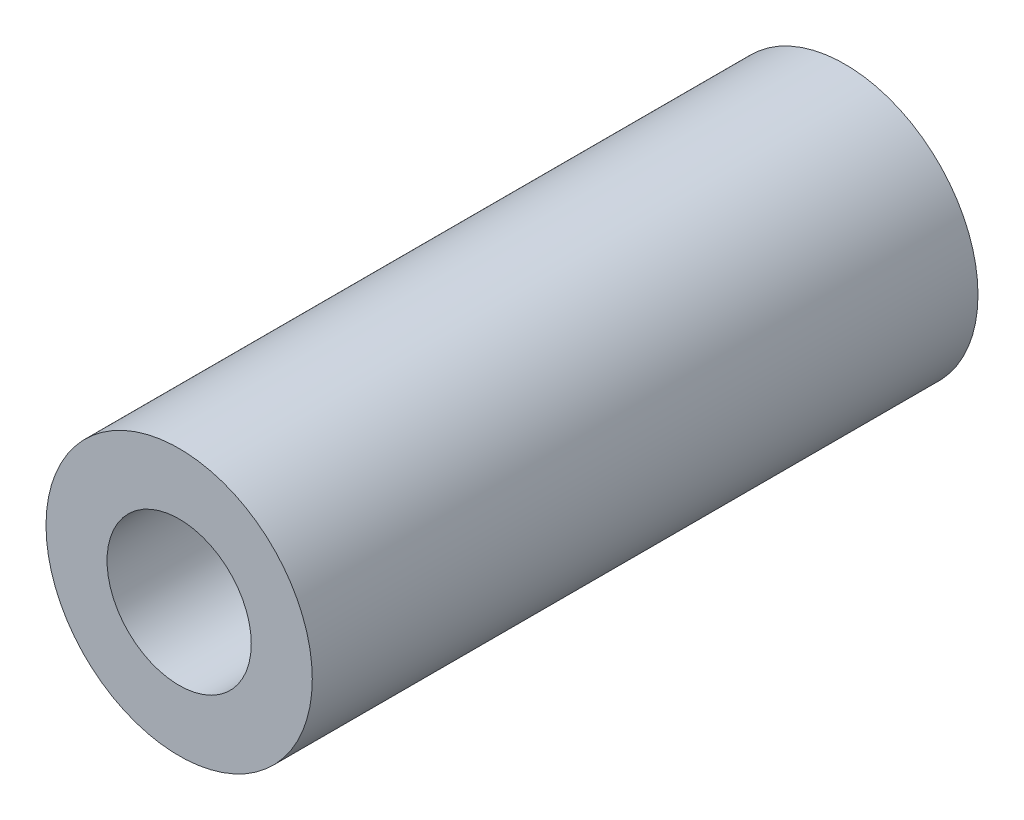
ISO-10303-21;
HEADER;
FILE_DESCRIPTION(('STEP AP214'),'2;1');
FILE_NAME('part.step','',(''),(''),'','','');
FILE_SCHEMA(('AUTOMOTIVE_DESIGN { 1 0 10303 214 1 1 1 1 }'));
ENDSEC;
DATA;
#1=APPLICATION_CONTEXT('core data for automotive mechanical design processes');
#2=APPLICATION_PROTOCOL_DEFINITION('international standard','automotive_design',2000,#1);
#3=PRODUCT_CONTEXT('',#1,'mechanical');
#4=PRODUCT('Part','Part','',(#3));
#5=PRODUCT_RELATED_PRODUCT_CATEGORY('part','',(#4));
#6=PRODUCT_DEFINITION_FORMATION('','',#4);
#7=PRODUCT_DEFINITION_CONTEXT('part definition',#1,'design');
#8=PRODUCT_DEFINITION('design','',#6,#7);
#9=PRODUCT_DEFINITION_SHAPE('','',#8);
#10=(LENGTH_UNIT() NAMED_UNIT(*) SI_UNIT(.MILLI.,.METRE.));
#11=(NAMED_UNIT(*) PLANE_ANGLE_UNIT() SI_UNIT($,.RADIAN.));
#12=(NAMED_UNIT(*) SI_UNIT($,.STERADIAN.) SOLID_ANGLE_UNIT());
#13=UNCERTAINTY_MEASURE_WITH_UNIT(LENGTH_MEASURE(1.E-05),#10,'distance_accuracy_value','');
#14=(GEOMETRIC_REPRESENTATION_CONTEXT(3) GLOBAL_UNCERTAINTY_ASSIGNED_CONTEXT((#13)) GLOBAL_UNIT_ASSIGNED_CONTEXT((#10,
#11,#12)) REPRESENTATION_CONTEXT('',''));
#15=CARTESIAN_POINT('',(0.,0.,0.));
#16=DIRECTION('',(0.,0.,1.));
#17=DIRECTION('',(1.,0.,0.));
#18=AXIS2_PLACEMENT_3D('',#15,#16,#17);
#19=CARTESIAN_POINT('',(0.,0.,30.));
#20=DIRECTION('',(0.,0.,1.));
#21=DIRECTION('',(1.,0.,0.));
#22=AXIS2_PLACEMENT_3D('',#19,#20,#21);
#23=PLANE('',#22);
#24=CARTESIAN_POINT('',(0.,0.,30.));
#25=DIRECTION('',(0.,0.,1.));
#26=DIRECTION('',(1.,0.,0.));
#27=AXIS2_PLACEMENT_3D('',#24,#25,#26);
#28=CIRCLE('',#27,6.);
#29=CARTESIAN_POINT('',(6.,0.,30.));
#30=VERTEX_POINT('',#29);
#31=EDGE_CURVE('E10',#30,#30,#28,.T.);
#32=ORIENTED_EDGE('',*,*,#31,.T.);
#33=EDGE_LOOP('',(#32));
#34=FACE_BOUND('',#33,.T.);
#35=CARTESIAN_POINT('',(0.,0.,30.));
#36=DIRECTION('',(0.,0.,1.));
#37=DIRECTION('',(1.,0.,0.));
#38=AXIS2_PLACEMENT_3D('',#35,#36,#37);
#39=CIRCLE('',#38,3.25);
#40=CARTESIAN_POINT('',(3.25,0.,30.));
#41=VERTEX_POINT('',#40);
#42=EDGE_CURVE('E48',#41,#41,#39,.T.);
#43=ORIENTED_EDGE('',*,*,#42,.F.);
#44=EDGE_LOOP('',(#43));
#45=FACE_BOUND('',#44,.T.);
#46=ADVANCED_FACE('F37',(#34,#45),#23,.T.);
#47=CARTESIAN_POINT('',(0.,0.,0.));
#48=DIRECTION('',(0.,0.,1.));
#49=DIRECTION('',(1.,0.,0.));
#50=AXIS2_PLACEMENT_3D('',#47,#48,#49);
#51=PLANE('',#50);
#52=CARTESIAN_POINT('',(0.,0.,0.));
#53=DIRECTION('',(0.,0.,1.));
#54=DIRECTION('',(1.,0.,0.));
#55=AXIS2_PLACEMENT_3D('',#52,#53,#54);
#56=CIRCLE('',#55,6.);
#57=CARTESIAN_POINT('',(6.,0.,0.));
#58=VERTEX_POINT('',#57);
#59=EDGE_CURVE('E41',#58,#58,#56,.T.);
#60=ORIENTED_EDGE('',*,*,#59,.F.);
#61=EDGE_LOOP('',(#60));
#62=FACE_BOUND('',#61,.T.);
#63=CARTESIAN_POINT('',(0.,0.,0.));
#64=DIRECTION('',(0.,0.,1.));
#65=DIRECTION('',(1.,0.,0.));
#66=AXIS2_PLACEMENT_3D('',#63,#64,#65);
#67=CIRCLE('',#66,3.25);
#68=CARTESIAN_POINT('',(3.25,0.,0.));
#69=VERTEX_POINT('',#68);
#70=EDGE_CURVE('E50',#69,#69,#67,.T.);
#71=ORIENTED_EDGE('',*,*,#70,.T.);
#72=EDGE_LOOP('',(#71));
#73=FACE_BOUND('',#72,.T.);
#74=ADVANCED_FACE('F60',(#62,#73),#51,.F.);
#75=CARTESIAN_POINT('',(0.,0.,30.));
#76=DIRECTION('',(0.,0.,-1.));
#77=DIRECTION('',(-1.,0.,0.));
#78=AXIS2_PLACEMENT_3D('',#75,#76,#77);
#79=CYLINDRICAL_SURFACE('',#78,6.);
#80=ORIENTED_EDGE('',*,*,#31,.F.);
#81=EDGE_LOOP('',(#80));
#82=FACE_BOUND('',#81,.T.);
#83=ORIENTED_EDGE('',*,*,#59,.T.);
#84=EDGE_LOOP('',(#83));
#85=FACE_BOUND('',#84,.T.);
#86=ADVANCED_FACE('F39',(#82,#85),#79,.T.);
#87=CARTESIAN_POINT('',(0.,0.,30.));
#88=DIRECTION('',(0.,0.,-1.));
#89=DIRECTION('',(-1.,0.,0.));
#90=AXIS2_PLACEMENT_3D('',#87,#88,#89);
#91=CYLINDRICAL_SURFACE('',#90,3.25);
#92=ORIENTED_EDGE('',*,*,#42,.T.);
#93=EDGE_LOOP('',(#92));
#94=FACE_BOUND('',#93,.T.);
#95=ORIENTED_EDGE('',*,*,#70,.F.);
#96=EDGE_LOOP('',(#95));
#97=FACE_BOUND('',#96,.T.);
#98=ADVANCED_FACE('F56',(#94,#97),#91,.F.);
#99=CLOSED_SHELL('',(#46,#74,#86,#98));
#100=MANIFOLD_SOLID_BREP('B2',#99);
#101=ADVANCED_BREP_SHAPE_REPRESENTATION('',(#18,#100),#14);
#102=SHAPE_DEFINITION_REPRESENTATION(#9,#101);
ENDSEC;
END-ISO-10303-21;
